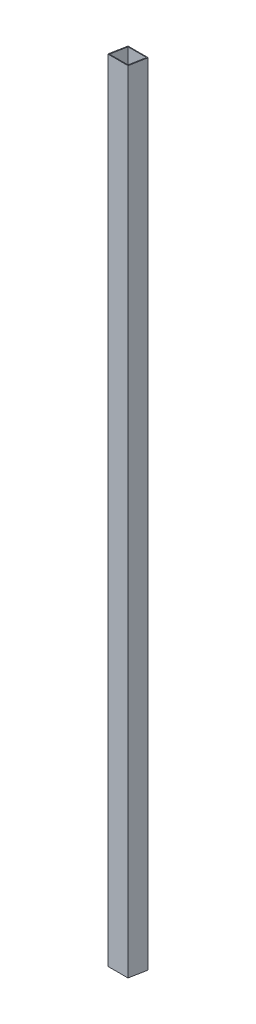
ISO-10303-21;
HEADER;
FILE_DESCRIPTION(('STEP AP214'),'2;1');
FILE_NAME('part.step','',(''),(''),'','','');
FILE_SCHEMA(('AUTOMOTIVE_DESIGN { 1 0 10303 214 1 1 1 1 }'));
ENDSEC;
DATA;
#1=APPLICATION_CONTEXT('core data for automotive mechanical design processes');
#2=APPLICATION_PROTOCOL_DEFINITION('international standard','automotive_design',2000,#1);
#3=PRODUCT_CONTEXT('',#1,'mechanical');
#4=PRODUCT('Part','Part','',(#3));
#5=PRODUCT_RELATED_PRODUCT_CATEGORY('part','',(#4));
#6=PRODUCT_DEFINITION_FORMATION('','',#4);
#7=PRODUCT_DEFINITION_CONTEXT('part definition',#1,'design');
#8=PRODUCT_DEFINITION('design','',#6,#7);
#9=PRODUCT_DEFINITION_SHAPE('','',#8);
#10=(LENGTH_UNIT() NAMED_UNIT(*) SI_UNIT(.MILLI.,.METRE.));
#11=(NAMED_UNIT(*) PLANE_ANGLE_UNIT() SI_UNIT($,.RADIAN.));
#12=(NAMED_UNIT(*) SI_UNIT($,.STERADIAN.) SOLID_ANGLE_UNIT());
#13=UNCERTAINTY_MEASURE_WITH_UNIT(LENGTH_MEASURE(1.E-05),#10,'distance_accuracy_value','');
#14=(GEOMETRIC_REPRESENTATION_CONTEXT(3) GLOBAL_UNCERTAINTY_ASSIGNED_CONTEXT((#13)) GLOBAL_UNIT_ASSIGNED_CONTEXT((#10,
#11,#12)) REPRESENTATION_CONTEXT('',''));
#15=CARTESIAN_POINT('',(0.,0.,0.));
#16=DIRECTION('',(0.,0.,1.));
#17=DIRECTION('',(1.,0.,0.));
#18=AXIS2_PLACEMENT_3D('',#15,#16,#17);
#19=CARTESIAN_POINT('',(-11.5,1200.,-11.5));
#20=DIRECTION('',(0.,0.,1.));
#21=DIRECTION('',(1.,0.,0.));
#22=AXIS2_PLACEMENT_3D('',#19,#20,#21);
#23=PLANE('',#22);
#24=DIRECTION('',(-1.,0.,0.));
#25=VECTOR('',#24,1.);
#26=CARTESIAN_POINT('',(-11.5,0.158384440324788,-11.5));
#27=LINE('',#26,#25);
#28=CARTESIAN_POINT('',(11.5,0.158384440324788,-11.5));
#29=VERTEX_POINT('',#28);
#30=CARTESIAN_POINT('',(-11.5,0.158384440324788,-11.5));
#31=VERTEX_POINT('',#30);
#32=EDGE_CURVE('E11',#29,#31,#27,.T.);
#33=ORIENTED_EDGE('',*,*,#32,.F.);
#34=DIRECTION('',(0.,-1.,0.));
#35=VECTOR('',#34,1.);
#36=CARTESIAN_POINT('',(11.5,1200.,-11.5));
#37=LINE('',#36,#35);
#38=CARTESIAN_POINT('',(11.5,977.187230825746,-11.5));
#39=VERTEX_POINT('',#38);
#40=EDGE_CURVE('E150',#39,#29,#37,.T.);
#41=ORIENTED_EDGE('',*,*,#40,.F.);
#42=DIRECTION('',(1.,0.,0.));
#43=VECTOR('',#42,1.);
#44=CARTESIAN_POINT('',(-11.5,977.187230825746,-11.5));
#45=LINE('',#44,#43);
#46=CARTESIAN_POINT('',(-11.5,977.187230825746,-11.5));
#47=VERTEX_POINT('',#46);
#48=EDGE_CURVE('E47',#47,#39,#45,.T.);
#49=ORIENTED_EDGE('',*,*,#48,.F.);
#50=DIRECTION('',(0.,-1.,0.));
#51=VECTOR('',#50,1.);
#52=CARTESIAN_POINT('',(-11.5,1200.,-11.5));
#53=LINE('',#52,#51);
#54=EDGE_CURVE('E155',#47,#31,#53,.T.);
#55=ORIENTED_EDGE('',*,*,#54,.T.);
#56=EDGE_LOOP('',(#33,#41,#49,#55));
#57=FACE_BOUND('',#56,.T.);
#58=ADVANCED_FACE('F39',(#57),#23,.T.);
#59=CARTESIAN_POINT('',(11.5,1200.,11.5));
#60=DIRECTION('',(-1.,0.,0.));
#61=DIRECTION('',(0.,0.,1.));
#62=AXIS2_PLACEMENT_3D('',#59,#60,#61);
#63=PLANE('',#62);
#64=DIRECTION('',(0.,-0.156434465040217,-0.98768834059514));
#65=VECTOR('',#64,1.);
#66=CARTESIAN_POINT('',(11.5,33.0742941554016,196.322874820494));
#67=LINE('',#66,#65);
#68=CARTESIAN_POINT('',(11.5,3.80122656778858,11.5));
#69=VERTEX_POINT('',#68);
#70=EDGE_CURVE('E163',#69,#29,#67,.T.);
#71=ORIENTED_EDGE('',*,*,#70,.F.);
#72=DIRECTION('',(0.,-1.,0.));
#73=VECTOR('',#72,1.);
#74=CARTESIAN_POINT('',(11.5,1200.,11.5));
#75=LINE('',#74,#73);
#76=CARTESIAN_POINT('',(11.5,980.83007295321,11.5));
#77=VERTEX_POINT('',#76);
#78=EDGE_CURVE('E128',#77,#69,#75,.T.);
#79=ORIENTED_EDGE('',*,*,#78,.F.);
#80=DIRECTION('',(0.,0.156434465040225,0.987688340595139));
#81=VECTOR('',#80,1.);
#82=CARTESIAN_POINT('',(11.5,986.193542829713,45.3636160566865));
#83=LINE('',#82,#81);
#84=EDGE_CURVE('E137',#39,#77,#83,.T.);
#85=ORIENTED_EDGE('',*,*,#84,.F.);
#86=ORIENTED_EDGE('',*,*,#40,.T.);
#87=EDGE_LOOP('',(#71,#79,#85,#86));
#88=FACE_BOUND('',#87,.T.);
#89=ADVANCED_FACE('F149',(#88),#63,.T.);
#90=CARTESIAN_POINT('',(-11.5,1200.,11.5));
#91=DIRECTION('',(0.,0.,-1.));
#92=DIRECTION('',(-1.,0.,0.));
#93=AXIS2_PLACEMENT_3D('',#90,#91,#92);
#94=PLANE('',#93);
#95=DIRECTION('',(1.,0.,0.));
#96=VECTOR('',#95,1.);
#97=CARTESIAN_POINT('',(-11.5,3.8012265677887,11.5));
#98=LINE('',#97,#96);
#99=CARTESIAN_POINT('',(-11.5,3.8012265677887,11.5));
#100=VERTEX_POINT('',#99);
#101=EDGE_CURVE('E161',#100,#69,#98,.T.);
#102=ORIENTED_EDGE('',*,*,#101,.F.);
#103=DIRECTION('',(0.,-1.,0.));
#104=VECTOR('',#103,1.);
#105=CARTESIAN_POINT('',(-11.5,1200.,11.5));
#106=LINE('',#105,#104);
#107=CARTESIAN_POINT('',(-11.5,980.83007295321,11.5));
#108=VERTEX_POINT('',#107);
#109=EDGE_CURVE('E123',#108,#100,#106,.T.);
#110=ORIENTED_EDGE('',*,*,#109,.F.);
#111=DIRECTION('',(-1.,0.,0.));
#112=VECTOR('',#111,1.);
#113=CARTESIAN_POINT('',(-11.5,980.83007295321,11.5));
#114=LINE('',#113,#112);
#115=EDGE_CURVE('E152',#77,#108,#114,.T.);
#116=ORIENTED_EDGE('',*,*,#115,.F.);
#117=ORIENTED_EDGE('',*,*,#78,.T.);
#118=EDGE_LOOP('',(#102,#110,#116,#117));
#119=FACE_BOUND('',#118,.T.);
#120=ADVANCED_FACE('F189',(#119),#94,.T.);
#121=CARTESIAN_POINT('',(-11.5,1200.,11.5));
#122=DIRECTION('',(1.,0.,0.));
#123=DIRECTION('',(0.,0.,-1.));
#124=AXIS2_PLACEMENT_3D('',#121,#122,#123);
#125=PLANE('',#124);
#126=DIRECTION('',(0.,0.156434465040217,0.98768834059514));
#127=VECTOR('',#126,1.);
#128=CARTESIAN_POINT('',(-11.5,33.0742941554016,196.322874820494));
#129=LINE('',#128,#127);
#130=EDGE_CURVE('E157',#31,#100,#129,.T.);
#131=ORIENTED_EDGE('',*,*,#130,.F.);
#132=ORIENTED_EDGE('',*,*,#54,.F.);
#133=DIRECTION('',(0.,-0.156434465040225,-0.987688340595139));
#134=VECTOR('',#133,1.);
#135=CARTESIAN_POINT('',(-11.5,986.193542829713,45.3636160566865));
#136=LINE('',#135,#134);
#137=EDGE_CURVE('E140',#108,#47,#136,.T.);
#138=ORIENTED_EDGE('',*,*,#137,.F.);
#139=ORIENTED_EDGE('',*,*,#109,.T.);
#140=EDGE_LOOP('',(#131,#132,#138,#139));
#141=FACE_BOUND('',#140,.T.);
#142=ADVANCED_FACE('F181',(#141),#125,.T.);
#143=CARTESIAN_POINT('',(-12.5,980.988457393535,12.5));
#144=DIRECTION('',(0.,-0.987688340595139,0.156434465040225));
#145=DIRECTION('',(0.,-0.156434465040225,-0.987688340595139));
#146=AXIS2_PLACEMENT_3D('',#143,#144,#145);
#147=PLANE('',#146);
#148=ORIENTED_EDGE('',*,*,#137,.T.);
#149=ORIENTED_EDGE('',*,*,#48,.T.);
#150=ORIENTED_EDGE('',*,*,#84,.T.);
#151=ORIENTED_EDGE('',*,*,#115,.T.);
#152=EDGE_LOOP('',(#148,#149,#150,#151));
#153=FACE_BOUND('',#152,.T.);
#154=DIRECTION('',(0.,-0.156434465040225,-0.987688340595139));
#155=VECTOR('',#154,1.);
#156=CARTESIAN_POINT('',(12.5,980.988457393535,12.5));
#157=LINE('',#156,#155);
#158=CARTESIAN_POINT('',(12.5,980.988457393535,12.5));
#159=VERTEX_POINT('',#158);
#160=CARTESIAN_POINT('',(12.5,977.028846385422,-12.5));
#161=VERTEX_POINT('',#160);
#162=EDGE_CURVE('E168',#159,#161,#157,.T.);
#163=ORIENTED_EDGE('',*,*,#162,.T.);
#164=DIRECTION('',(1.,0.,0.));
#165=VECTOR('',#164,1.);
#166=CARTESIAN_POINT('',(-12.5,977.028846385422,-12.5));
#167=LINE('',#166,#165);
#168=CARTESIAN_POINT('',(-12.5,977.028846385422,-12.5));
#169=VERTEX_POINT('',#168);
#170=EDGE_CURVE('E171',#169,#161,#167,.T.);
#171=ORIENTED_EDGE('',*,*,#170,.F.);
#172=DIRECTION('',(0.,-0.156434465040225,-0.987688340595139));
#173=VECTOR('',#172,1.);
#174=CARTESIAN_POINT('',(-12.5,980.988457393535,12.5));
#175=LINE('',#174,#173);
#176=CARTESIAN_POINT('',(-12.5,980.988457393535,12.5));
#177=VERTEX_POINT('',#176);
#178=EDGE_CURVE('E54',#177,#169,#175,.T.);
#179=ORIENTED_EDGE('',*,*,#178,.F.);
#180=DIRECTION('',(1.,0.,0.));
#181=VECTOR('',#180,1.);
#182=CARTESIAN_POINT('',(-12.5,980.988457393535,12.5));
#183=LINE('',#182,#181);
#184=EDGE_CURVE('E169',#177,#159,#183,.T.);
#185=ORIENTED_EDGE('',*,*,#184,.T.);
#186=EDGE_LOOP('',(#163,#171,#179,#185));
#187=FACE_BOUND('',#186,.T.);
#188=ADVANCED_FACE('F136',(#153,#187),#147,.F.);
#189=CARTESIAN_POINT('',(-12.5,0.,-12.5));
#190=DIRECTION('',(0.,0.98768834059514,-0.156434465040217));
#191=DIRECTION('',(0.,0.156434465040217,0.98768834059514));
#192=AXIS2_PLACEMENT_3D('',#189,#190,#191);
#193=PLANE('',#192);
#194=ORIENTED_EDGE('',*,*,#130,.T.);
#195=ORIENTED_EDGE('',*,*,#101,.T.);
#196=ORIENTED_EDGE('',*,*,#70,.T.);
#197=ORIENTED_EDGE('',*,*,#32,.T.);
#198=EDGE_LOOP('',(#194,#195,#196,#197));
#199=FACE_BOUND('',#198,.T.);
#200=DIRECTION('',(0.,0.156434465040217,0.98768834059514));
#201=VECTOR('',#200,1.);
#202=CARTESIAN_POINT('',(12.5,0.,-12.5));
#203=LINE('',#202,#201);
#204=CARTESIAN_POINT('',(12.5,0.,-12.5));
#205=VERTEX_POINT('',#204);
#206=CARTESIAN_POINT('',(12.5,3.95961100811304,12.5));
#207=VERTEX_POINT('',#206);
#208=EDGE_CURVE('E62',#205,#207,#203,.T.);
#209=ORIENTED_EDGE('',*,*,#208,.T.);
#210=DIRECTION('',(1.,0.,0.));
#211=VECTOR('',#210,1.);
#212=CARTESIAN_POINT('',(-12.5,3.95961100811304,12.5));
#213=LINE('',#212,#211);
#214=CARTESIAN_POINT('',(-12.5,3.95961100811304,12.5));
#215=VERTEX_POINT('',#214);
#216=EDGE_CURVE('E106',#215,#207,#213,.T.);
#217=ORIENTED_EDGE('',*,*,#216,.F.);
#218=DIRECTION('',(0.,0.156434465040217,0.98768834059514));
#219=VECTOR('',#218,1.);
#220=CARTESIAN_POINT('',(-12.5,0.,-12.5));
#221=LINE('',#220,#219);
#222=CARTESIAN_POINT('',(-12.5,0.,-12.5));
#223=VERTEX_POINT('',#222);
#224=EDGE_CURVE('E101',#223,#215,#221,.T.);
#225=ORIENTED_EDGE('',*,*,#224,.F.);
#226=DIRECTION('',(-1.,0.,0.));
#227=VECTOR('',#226,1.);
#228=CARTESIAN_POINT('',(-12.5,0.,-12.5));
#229=LINE('',#228,#227);
#230=EDGE_CURVE('E105',#205,#223,#229,.T.);
#231=ORIENTED_EDGE('',*,*,#230,.F.);
#232=EDGE_LOOP('',(#209,#217,#225,#231));
#233=FACE_BOUND('',#232,.T.);
#234=ADVANCED_FACE('F103',(#199,#233),#193,.F.);
#235=CARTESIAN_POINT('',(12.5,1200.,12.5));
#236=DIRECTION('',(-1.,0.,0.));
#237=DIRECTION('',(0.,0.,1.));
#238=AXIS2_PLACEMENT_3D('',#235,#236,#237);
#239=PLANE('',#238);
#240=DIRECTION('',(0.,-1.,0.));
#241=VECTOR('',#240,1.);
#242=CARTESIAN_POINT('',(12.5,1200.,12.5));
#243=LINE('',#242,#241);
#244=EDGE_CURVE('E122',#159,#207,#243,.T.);
#245=ORIENTED_EDGE('',*,*,#244,.T.);
#246=ORIENTED_EDGE('',*,*,#208,.F.);
#247=DIRECTION('',(0.,-1.,0.));
#248=VECTOR('',#247,1.);
#249=CARTESIAN_POINT('',(12.5,1200.,-12.5));
#250=LINE('',#249,#248);
#251=EDGE_CURVE('E116',#161,#205,#250,.T.);
#252=ORIENTED_EDGE('',*,*,#251,.F.);
#253=ORIENTED_EDGE('',*,*,#162,.F.);
#254=EDGE_LOOP('',(#245,#246,#252,#253));
#255=FACE_BOUND('',#254,.T.);
#256=ADVANCED_FACE('F41',(#255),#239,.F.);
#257=CARTESIAN_POINT('',(-12.5,1200.,-12.5));
#258=DIRECTION('',(0.,0.,1.));
#259=DIRECTION('',(1.,0.,0.));
#260=AXIS2_PLACEMENT_3D('',#257,#258,#259);
#261=PLANE('',#260);
#262=DIRECTION('',(0.,-1.,0.));
#263=VECTOR('',#262,1.);
#264=CARTESIAN_POINT('',(-12.5,1200.,-12.5));
#265=LINE('',#264,#263);
#266=EDGE_CURVE('E112',#169,#223,#265,.T.);
#267=ORIENTED_EDGE('',*,*,#266,.F.);
#268=ORIENTED_EDGE('',*,*,#170,.T.);
#269=ORIENTED_EDGE('',*,*,#251,.T.);
#270=ORIENTED_EDGE('',*,*,#230,.T.);
#271=EDGE_LOOP('',(#267,#268,#269,#270));
#272=FACE_BOUND('',#271,.T.);
#273=ADVANCED_FACE('F120',(#272),#261,.F.);
#274=CARTESIAN_POINT('',(-12.5,1200.,12.5));
#275=DIRECTION('',(1.,0.,0.));
#276=DIRECTION('',(0.,0.,-1.));
#277=AXIS2_PLACEMENT_3D('',#274,#275,#276);
#278=PLANE('',#277);
#279=ORIENTED_EDGE('',*,*,#266,.T.);
#280=ORIENTED_EDGE('',*,*,#224,.T.);
#281=DIRECTION('',(0.,-1.,0.));
#282=VECTOR('',#281,1.);
#283=CARTESIAN_POINT('',(-12.5,1200.,12.5));
#284=LINE('',#283,#282);
#285=EDGE_CURVE('E117',#177,#215,#284,.T.);
#286=ORIENTED_EDGE('',*,*,#285,.F.);
#287=ORIENTED_EDGE('',*,*,#178,.T.);
#288=EDGE_LOOP('',(#279,#280,#286,#287));
#289=FACE_BOUND('',#288,.T.);
#290=ADVANCED_FACE('F113',(#289),#278,.F.);
#291=CARTESIAN_POINT('',(-12.5,1200.,12.5));
#292=DIRECTION('',(0.,0.,-1.));
#293=DIRECTION('',(-1.,0.,0.));
#294=AXIS2_PLACEMENT_3D('',#291,#292,#293);
#295=PLANE('',#294);
#296=ORIENTED_EDGE('',*,*,#285,.T.);
#297=ORIENTED_EDGE('',*,*,#216,.T.);
#298=ORIENTED_EDGE('',*,*,#244,.F.);
#299=ORIENTED_EDGE('',*,*,#184,.F.);
#300=EDGE_LOOP('',(#296,#297,#298,#299));
#301=FACE_BOUND('',#300,.T.);
#302=ADVANCED_FACE('F177',(#301),#295,.F.);
#303=CLOSED_SHELL('',(#58,#89,#120,#142,#188,#234,#256,#273,#290,#302));
#304=MANIFOLD_SOLID_BREP('B2',#303);
#305=ADVANCED_BREP_SHAPE_REPRESENTATION('',(#18,#304),#14);
#306=SHAPE_DEFINITION_REPRESENTATION(#9,#305);
ENDSEC;
END-ISO-10303-21;
